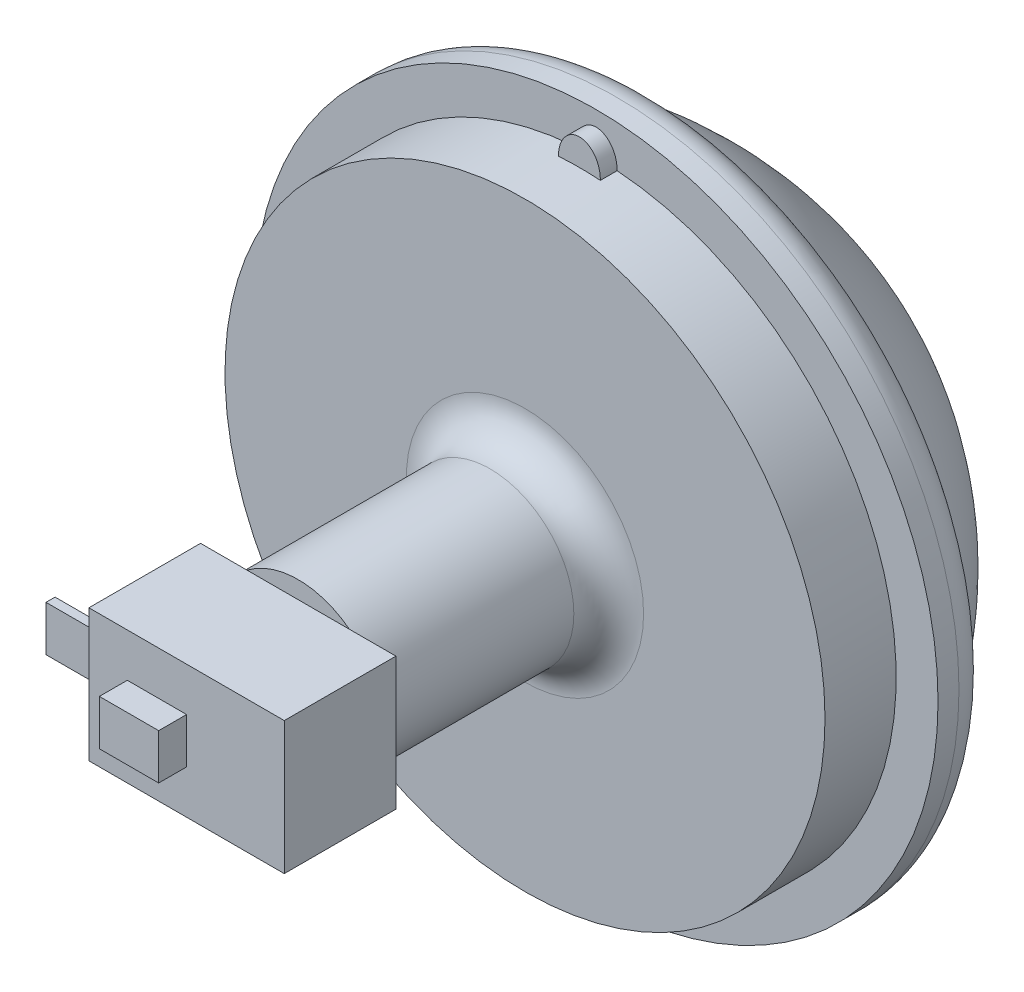
ISO-10303-21;
HEADER;
FILE_DESCRIPTION(('STEP AP214'),'2;1');
FILE_NAME('part.step','',(''),(''),'','','');
FILE_SCHEMA(('AUTOMOTIVE_DESIGN { 1 0 10303 214 1 1 1 1 }'));
ENDSEC;
DATA;
#1=APPLICATION_CONTEXT('core data for automotive mechanical design processes');
#2=APPLICATION_PROTOCOL_DEFINITION('international standard','automotive_design',2000,#1);
#3=PRODUCT_CONTEXT('',#1,'mechanical');
#4=PRODUCT('Part','Part','',(#3));
#5=PRODUCT_RELATED_PRODUCT_CATEGORY('part','',(#4));
#6=PRODUCT_DEFINITION_FORMATION('','',#4);
#7=PRODUCT_DEFINITION_CONTEXT('part definition',#1,'design');
#8=PRODUCT_DEFINITION('design','',#6,#7);
#9=PRODUCT_DEFINITION_SHAPE('','',#8);
#10=(LENGTH_UNIT() NAMED_UNIT(*) SI_UNIT(.MILLI.,.METRE.));
#11=(NAMED_UNIT(*) PLANE_ANGLE_UNIT() SI_UNIT($,.RADIAN.));
#12=(NAMED_UNIT(*) SI_UNIT($,.STERADIAN.) SOLID_ANGLE_UNIT());
#13=UNCERTAINTY_MEASURE_WITH_UNIT(LENGTH_MEASURE(1.E-05),#10,'distance_accuracy_value','');
#14=(GEOMETRIC_REPRESENTATION_CONTEXT(3) GLOBAL_UNCERTAINTY_ASSIGNED_CONTEXT((#13)) GLOBAL_UNIT_ASSIGNED_CONTEXT((#10,
#11,#12)) REPRESENTATION_CONTEXT('',''));
#15=CARTESIAN_POINT('',(0.,0.,0.));
#16=DIRECTION('',(0.,0.,1.));
#17=DIRECTION('',(1.,0.,0.));
#18=AXIS2_PLACEMENT_3D('',#15,#16,#17);
#19=CARTESIAN_POINT('',(0.,0.,10.2));
#20=DIRECTION('',(0.,0.,-1.));
#21=DIRECTION('',(-1.,0.,0.));
#22=AXIS2_PLACEMENT_3D('',#19,#20,#21);
#23=CYLINDRICAL_SURFACE('',#22,43.);
#24=CARTESIAN_POINT('',(0.,0.,10.2));
#25=DIRECTION('',(0.,0.,1.));
#26=DIRECTION('',(1.,0.,0.));
#27=AXIS2_PLACEMENT_3D('',#24,#25,#26);
#28=CIRCLE('',#27,43.);
#29=CARTESIAN_POINT('',(43.,0.,10.2));
#30=VERTEX_POINT('',#29);
#31=EDGE_CURVE('E242',#30,#30,#28,.T.);
#32=ORIENTED_EDGE('',*,*,#31,.F.);
#33=EDGE_LOOP('',(#32));
#34=FACE_BOUND('',#33,.T.);
#35=DIRECTION('',(0.,0.,-1.));
#36=VECTOR('',#35,1.);
#37=CARTESIAN_POINT('',(-2.99886108033144,42.8953008174657,2.4));
#38=LINE('',#37,#36);
#39=CARTESIAN_POINT('',(-2.99886108033149,42.8953008174657,0.));
#40=VERTEX_POINT('',#39);
#41=CARTESIAN_POINT('',(-2.99886108033149,42.8953008174657,2.4));
#42=VERTEX_POINT('',#41);
#43=EDGE_CURVE('E11',#40,#42,#38,.F.);
#44=ORIENTED_EDGE('',*,*,#43,.F.);
#45=CARTESIAN_POINT('',(0.,0.,0.));
#46=DIRECTION('',(0.,0.,1.));
#47=DIRECTION('',(1.,0.,0.));
#48=AXIS2_PLACEMENT_3D('',#45,#46,#47);
#49=CIRCLE('',#48,43.);
#50=CARTESIAN_POINT('',(-2.99886108033149,-42.8953008174657,0.));
#51=VERTEX_POINT('',#50);
#52=EDGE_CURVE('E189',#40,#51,#49,.T.);
#53=ORIENTED_EDGE('',*,*,#52,.T.);
#54=DIRECTION('',(0.,0.,-1.));
#55=VECTOR('',#54,1.);
#56=CARTESIAN_POINT('',(-2.99886108033144,-42.8953008174657,2.4));
#57=LINE('',#56,#55);
#58=CARTESIAN_POINT('',(-2.99886108033149,-42.8953008174657,2.4));
#59=VERTEX_POINT('',#58);
#60=EDGE_CURVE('E216',#51,#59,#57,.F.);
#61=ORIENTED_EDGE('',*,*,#60,.T.);
#62=CARTESIAN_POINT('',(0.,0.,2.4));
#63=DIRECTION('',(0.,0.,-1.));
#64=DIRECTION('',(-1.,0.,0.));
#65=AXIS2_PLACEMENT_3D('',#62,#63,#64);
#66=CIRCLE('',#65,43.);
#67=CARTESIAN_POINT('',(2.99886108033149,-42.8953008174657,2.4));
#68=VERTEX_POINT('',#67);
#69=EDGE_CURVE('E75',#68,#59,#66,.T.);
#70=ORIENTED_EDGE('',*,*,#69,.F.);
#71=DIRECTION('',(0.,0.,-1.));
#72=VECTOR('',#71,1.);
#73=CARTESIAN_POINT('',(2.99886108033144,-42.8953008174657,2.4));
#74=LINE('',#73,#72);
#75=CARTESIAN_POINT('',(2.99886108033149,-42.8953008174657,0.));
#76=VERTEX_POINT('',#75);
#77=EDGE_CURVE('E212',#68,#76,#74,.T.);
#78=ORIENTED_EDGE('',*,*,#77,.T.);
#79=CARTESIAN_POINT('',(2.99886108033149,42.8953008174657,0.));
#80=VERTEX_POINT('',#79);
#81=EDGE_CURVE('E194',#76,#80,#49,.T.);
#82=ORIENTED_EDGE('',*,*,#81,.T.);
#83=DIRECTION('',(0.,0.,-1.));
#84=VECTOR('',#83,1.);
#85=CARTESIAN_POINT('',(2.99886108033144,42.8953008174657,2.4));
#86=LINE('',#85,#84);
#87=CARTESIAN_POINT('',(2.99886108033149,42.8953008174657,2.4));
#88=VERTEX_POINT('',#87);
#89=EDGE_CURVE('E62',#88,#80,#86,.T.);
#90=ORIENTED_EDGE('',*,*,#89,.F.);
#91=CARTESIAN_POINT('',(0.,0.,2.4));
#92=DIRECTION('',(0.,0.,1.));
#93=DIRECTION('',(1.,0.,0.));
#94=AXIS2_PLACEMENT_3D('',#91,#92,#93);
#95=CIRCLE('',#94,43.);
#96=EDGE_CURVE('E219',#88,#42,#95,.T.);
#97=ORIENTED_EDGE('',*,*,#96,.T.);
#98=EDGE_LOOP('',(#44,#53,#61,#70,#78,#82,#90,#97));
#99=FACE_BOUND('',#98,.T.);
#100=ADVANCED_FACE('F53',(#34,#99),#23,.T.);
#101=CARTESIAN_POINT('',(-14.,9.5,58.7));
#102=DIRECTION('',(1.,0.,0.));
#103=DIRECTION('',(0.,1.,0.));
#104=AXIS2_PLACEMENT_3D('',#101,#102,#103);
#105=PLANE('',#104);
#106=DIRECTION('',(0.,-1.,0.));
#107=VECTOR('',#106,1.);
#108=CARTESIAN_POINT('',(-14.,9.5,42.7));
#109=LINE('',#108,#107);
#110=CARTESIAN_POINT('',(-14.,9.5,42.7));
#111=VERTEX_POINT('',#110);
#112=CARTESIAN_POINT('',(-14.,-9.5,42.7));
#113=VERTEX_POINT('',#112);
#114=EDGE_CURVE('E295',#111,#113,#109,.T.);
#115=ORIENTED_EDGE('',*,*,#114,.T.);
#116=DIRECTION('',(0.,0.,-1.));
#117=VECTOR('',#116,1.);
#118=CARTESIAN_POINT('',(-14.,-9.5,58.7));
#119=LINE('',#118,#117);
#120=CARTESIAN_POINT('',(-14.,-9.5,58.7));
#121=VERTEX_POINT('',#120);
#122=EDGE_CURVE('E278',#121,#113,#119,.T.);
#123=ORIENTED_EDGE('',*,*,#122,.F.);
#124=DIRECTION('',(0.,-1.,0.));
#125=VECTOR('',#124,1.);
#126=CARTESIAN_POINT('',(-14.,9.5,58.7));
#127=LINE('',#126,#125);
#128=CARTESIAN_POINT('',(-14.,9.5,58.7));
#129=VERTEX_POINT('',#128);
#130=EDGE_CURVE('E308',#129,#121,#127,.T.);
#131=ORIENTED_EDGE('',*,*,#130,.F.);
#132=DIRECTION('',(0.,0.,-1.));
#133=VECTOR('',#132,1.);
#134=CARTESIAN_POINT('',(-14.,9.5,58.7));
#135=LINE('',#134,#133);
#136=EDGE_CURVE('E272',#129,#111,#135,.T.);
#137=ORIENTED_EDGE('',*,*,#136,.T.);
#138=EDGE_LOOP('',(#115,#123,#131,#137));
#139=FACE_BOUND('',#138,.T.);
#140=DIRECTION('',(0.,1.,0.));
#141=VECTOR('',#140,1.);
#142=CARTESIAN_POINT('',(-14.,3.25000000000001,54.85));
#143=LINE('',#142,#141);
#144=CARTESIAN_POINT('',(-14.,-3.24999999999999,54.85));
#145=VERTEX_POINT('',#144);
#146=CARTESIAN_POINT('',(-14.,3.25000000000001,54.85));
#147=VERTEX_POINT('',#146);
#148=EDGE_CURVE('E387',#145,#147,#143,.T.);
#149=ORIENTED_EDGE('',*,*,#148,.F.);
#150=DIRECTION('',(0.,0.,1.));
#151=VECTOR('',#150,1.);
#152=CARTESIAN_POINT('',(-14.,-3.24999999999999,53.55));
#153=LINE('',#152,#151);
#154=CARTESIAN_POINT('',(-14.,-3.24999999999999,53.55));
#155=VERTEX_POINT('',#154);
#156=EDGE_CURVE('E374',#155,#145,#153,.T.);
#157=ORIENTED_EDGE('',*,*,#156,.F.);
#158=DIRECTION('',(0.,-1.,0.));
#159=VECTOR('',#158,1.);
#160=CARTESIAN_POINT('',(-14.,3.25000000000001,53.55));
#161=LINE('',#160,#159);
#162=CARTESIAN_POINT('',(-14.,3.25000000000001,53.55));
#163=VERTEX_POINT('',#162);
#164=EDGE_CURVE('E379',#163,#155,#161,.T.);
#165=ORIENTED_EDGE('',*,*,#164,.F.);
#166=DIRECTION('',(0.,0.,-1.));
#167=VECTOR('',#166,1.);
#168=CARTESIAN_POINT('',(-14.,3.25000000000001,53.55));
#169=LINE('',#168,#167);
#170=EDGE_CURVE('E383',#147,#163,#169,.T.);
#171=ORIENTED_EDGE('',*,*,#170,.F.);
#172=EDGE_LOOP('',(#149,#157,#165,#171));
#173=FACE_BOUND('',#172,.T.);
#174=ADVANCED_FACE('F463',(#139,#173),#105,.F.);
#175=CARTESIAN_POINT('',(0.,0.,58.7));
#176=DIRECTION('',(0.,0.,1.));
#177=DIRECTION('',(1.,0.,0.));
#178=AXIS2_PLACEMENT_3D('',#175,#176,#177);
#179=PLANE('',#178);
#180=DIRECTION('',(0.,1.,0.));
#181=VECTOR('',#180,1.);
#182=CARTESIAN_POINT('',(14.,9.5,58.7));
#183=LINE('',#182,#181);
#184=CARTESIAN_POINT('',(14.,-9.5,58.7));
#185=VERTEX_POINT('',#184);
#186=CARTESIAN_POINT('',(14.,9.5,58.7));
#187=VERTEX_POINT('',#186);
#188=EDGE_CURVE('E293',#185,#187,#183,.T.);
#189=ORIENTED_EDGE('',*,*,#188,.T.);
#190=DIRECTION('',(-1.,0.,0.));
#191=VECTOR('',#190,1.);
#192=CARTESIAN_POINT('',(-14.,9.5,58.7));
#193=LINE('',#192,#191);
#194=EDGE_CURVE('E311',#187,#129,#193,.T.);
#195=ORIENTED_EDGE('',*,*,#194,.T.);
#196=ORIENTED_EDGE('',*,*,#130,.T.);
#197=DIRECTION('',(1.,0.,0.));
#198=VECTOR('',#197,1.);
#199=CARTESIAN_POINT('',(-14.,-9.5,58.7));
#200=LINE('',#199,#198);
#201=EDGE_CURVE('E288',#121,#185,#200,.T.);
#202=ORIENTED_EDGE('',*,*,#201,.T.);
#203=EDGE_LOOP('',(#189,#195,#196,#202));
#204=FACE_BOUND('',#203,.T.);
#205=DIRECTION('',(-1.,0.,0.));
#206=VECTOR('',#205,1.);
#207=CARTESIAN_POINT('',(0.,3.25,58.7));
#208=LINE('',#207,#206);
#209=CARTESIAN_POINT('',(0.,3.25,58.7));
#210=VERTEX_POINT('',#209);
#211=CARTESIAN_POINT('',(-8.5,3.25,58.7));
#212=VERTEX_POINT('',#211);
#213=EDGE_CURVE('E339',#210,#212,#208,.T.);
#214=ORIENTED_EDGE('',*,*,#213,.F.);
#215=DIRECTION('',(0.,1.,0.));
#216=VECTOR('',#215,1.);
#217=CARTESIAN_POINT('',(0.,3.25,58.7));
#218=LINE('',#217,#216);
#219=CARTESIAN_POINT('',(0.,-3.25,58.7));
#220=VERTEX_POINT('',#219);
#221=EDGE_CURVE('E342',#220,#210,#218,.T.);
#222=ORIENTED_EDGE('',*,*,#221,.F.);
#223=DIRECTION('',(1.,0.,0.));
#224=VECTOR('',#223,1.);
#225=CARTESIAN_POINT('',(0.,-3.25,58.7));
#226=LINE('',#225,#224);
#227=CARTESIAN_POINT('',(-8.5,-3.25,58.7));
#228=VERTEX_POINT('',#227);
#229=EDGE_CURVE('E331',#228,#220,#226,.T.);
#230=ORIENTED_EDGE('',*,*,#229,.F.);
#231=DIRECTION('',(0.,-1.,0.));
#232=VECTOR('',#231,1.);
#233=CARTESIAN_POINT('',(-8.5,3.25,58.7));
#234=LINE('',#233,#232);
#235=EDGE_CURVE('E335',#212,#228,#234,.T.);
#236=ORIENTED_EDGE('',*,*,#235,.F.);
#237=EDGE_LOOP('',(#214,#222,#230,#236));
#238=FACE_BOUND('',#237,.T.);
#239=ADVANCED_FACE('F459',(#204,#238),#179,.T.);
#240=CARTESIAN_POINT('',(0.,0.,42.7));
#241=DIRECTION('',(0.,0.,1.));
#242=DIRECTION('',(1.,0.,0.));
#243=AXIS2_PLACEMENT_3D('',#240,#241,#242);
#244=PLANE('',#243);
#245=DIRECTION('',(1.,0.,0.));
#246=VECTOR('',#245,1.);
#247=CARTESIAN_POINT('',(-14.,-9.5,42.7));
#248=LINE('',#247,#246);
#249=CARTESIAN_POINT('',(-7.33143914930759,-9.5,42.7));
#250=VERTEX_POINT('',#249);
#251=CARTESIAN_POINT('',(7.33143914930759,-9.5,42.7));
#252=VERTEX_POINT('',#251);
#253=EDGE_CURVE('E213',#250,#252,#248,.T.);
#254=ORIENTED_EDGE('',*,*,#253,.F.);
#255=CARTESIAN_POINT('',(0.,0.,42.7));
#256=DIRECTION('',(0.,0.,1.));
#257=DIRECTION('',(1.,0.,0.));
#258=AXIS2_PLACEMENT_3D('',#255,#256,#257);
#259=CIRCLE('',#258,12.);
#260=EDGE_CURVE('E260',#250,#252,#259,.T.);
#261=ORIENTED_EDGE('',*,*,#260,.T.);
#262=EDGE_LOOP('',(#254,#261));
#263=FACE_BOUND('',#262,.T.);
#264=ADVANCED_FACE('F462',(#263),#244,.T.);
#265=CARTESIAN_POINT('',(0.,0.,-8.));
#266=DIRECTION('',(0.,0.,1.));
#267=DIRECTION('',(1.,0.,0.));
#268=AXIS2_PLACEMENT_3D('',#265,#266,#267);
#269=CYLINDRICAL_SURFACE('',#268,49.);
#270=CARTESIAN_POINT('',(0.,0.,-3.));
#271=DIRECTION('',(0.,0.,1.));
#272=DIRECTION('',(1.,0.,0.));
#273=AXIS2_PLACEMENT_3D('',#270,#271,#272);
#274=CIRCLE('',#273,49.);
#275=CARTESIAN_POINT('',(49.,0.,-3.));
#276=VERTEX_POINT('',#275);
#277=EDGE_CURVE('E190',#276,#276,#274,.T.);
#278=ORIENTED_EDGE('',*,*,#277,.T.);
#279=EDGE_LOOP('',(#278));
#280=FACE_BOUND('',#279,.T.);
#281=CARTESIAN_POINT('',(0.,0.,0.));
#282=DIRECTION('',(0.,0.,1.));
#283=DIRECTION('',(1.,0.,0.));
#284=AXIS2_PLACEMENT_3D('',#281,#282,#283);
#285=CIRCLE('',#284,49.);
#286=CARTESIAN_POINT('',(49.,0.,0.));
#287=VERTEX_POINT('',#286);
#288=EDGE_CURVE('E197',#287,#287,#285,.T.);
#289=ORIENTED_EDGE('',*,*,#288,.F.);
#290=EDGE_LOOP('',(#289));
#291=FACE_BOUND('',#290,.T.);
#292=ADVANCED_FACE('F500',(#280,#291),#269,.T.);
#293=CARTESIAN_POINT('',(0.,0.,0.));
#294=DIRECTION('',(0.,0.,1.));
#295=DIRECTION('',(1.,0.,0.));
#296=AXIS2_PLACEMENT_3D('',#293,#294,#295);
#297=PLANE('',#296);
#298=ORIENTED_EDGE('',*,*,#52,.F.);
#299=CARTESIAN_POINT('',(0.,43.,0.));
#300=DIRECTION('',(0.,0.,1.));
#301=DIRECTION('',(0.,-1.,0.));
#302=AXIS2_PLACEMENT_3D('',#299,#300,#301);
#303=ELLIPSE('',#302,3.8,2.99999999999999);
#304=EDGE_CURVE('E227',#80,#40,#303,.T.);
#305=ORIENTED_EDGE('',*,*,#304,.F.);
#306=ORIENTED_EDGE('',*,*,#81,.F.);
#307=CARTESIAN_POINT('',(0.,-43.,0.));
#308=DIRECTION('',(0.,0.,-1.));
#309=DIRECTION('',(0.,1.,0.));
#310=AXIS2_PLACEMENT_3D('',#307,#308,#309);
#311=ELLIPSE('',#310,3.8,2.99999999999999);
#312=EDGE_CURVE('E238',#76,#51,#311,.T.);
#313=ORIENTED_EDGE('',*,*,#312,.T.);
#314=EDGE_LOOP('',(#298,#305,#306,#313));
#315=FACE_BOUND('',#314,.T.);
#316=ORIENTED_EDGE('',*,*,#288,.T.);
#317=EDGE_LOOP('',(#316));
#318=FACE_BOUND('',#317,.T.);
#319=ADVANCED_FACE('F233',(#315,#318),#297,.T.);
#320=CARTESIAN_POINT('',(0.,0.,-3.));
#321=DIRECTION('',(0.,0.,1.));
#322=DIRECTION('',(1.,0.,0.));
#323=AXIS2_PLACEMENT_3D('',#320,#321,#322);
#324=TOROIDAL_SURFACE('',#323,44.,5.);
#325=CARTESIAN_POINT('',(0.,0.,-8.));
#326=DIRECTION('',(0.,0.,1.));
#327=DIRECTION('',(1.,0.,0.));
#328=AXIS2_PLACEMENT_3D('',#325,#326,#327);
#329=CIRCLE('',#328,44.);
#330=CARTESIAN_POINT('',(44.,0.,-8.));
#331=VERTEX_POINT('',#330);
#332=EDGE_CURVE('E186',#331,#331,#329,.F.);
#333=ORIENTED_EDGE('',*,*,#332,.F.);
#334=EDGE_LOOP('',(#333));
#335=FACE_BOUND('',#334,.T.);
#336=ORIENTED_EDGE('',*,*,#277,.F.);
#337=EDGE_LOOP('',(#336));
#338=FACE_BOUND('',#337,.T.);
#339=ADVANCED_FACE('F493',(#335,#338),#324,.T.);
#340=CARTESIAN_POINT('',(0.,0.,10.2));
#341=DIRECTION('',(0.,0.,1.));
#342=DIRECTION('',(1.,0.,0.));
#343=AXIS2_PLACEMENT_3D('',#340,#341,#342);
#344=PLANE('',#343);
#345=CARTESIAN_POINT('',(0.,0.,10.2));
#346=DIRECTION('',(0.,0.,1.));
#347=DIRECTION('',(1.,0.,0.));
#348=AXIS2_PLACEMENT_3D('',#345,#346,#347);
#349=CIRCLE('',#348,17.);
#350=CARTESIAN_POINT('',(17.,0.,10.2));
#351=VERTEX_POINT('',#350);
#352=EDGE_CURVE('E205',#351,#351,#349,.F.);
#353=ORIENTED_EDGE('',*,*,#352,.T.);
#354=EDGE_LOOP('',(#353));
#355=FACE_BOUND('',#354,.T.);
#356=ORIENTED_EDGE('',*,*,#31,.T.);
#357=EDGE_LOOP('',(#356));
#358=FACE_BOUND('',#357,.T.);
#359=ADVANCED_FACE('F489',(#355,#358),#344,.T.);
#360=CARTESIAN_POINT('',(0.,0.,42.7));
#361=DIRECTION('',(0.,0.,-1.));
#362=DIRECTION('',(-1.,0.,0.));
#363=AXIS2_PLACEMENT_3D('',#360,#361,#362);
#364=CYLINDRICAL_SURFACE('',#363,12.);
#365=CARTESIAN_POINT('',(0.,0.,15.2));
#366=DIRECTION('',(0.,0.,1.));
#367=DIRECTION('',(1.,0.,0.));
#368=AXIS2_PLACEMENT_3D('',#365,#366,#367);
#369=CIRCLE('',#368,12.);
#370=CARTESIAN_POINT('',(12.,0.,15.2));
#371=VERTEX_POINT('',#370);
#372=EDGE_CURVE('E201',#371,#371,#369,.T.);
#373=ORIENTED_EDGE('',*,*,#372,.T.);
#374=EDGE_LOOP('',(#373));
#375=FACE_BOUND('',#374,.T.);
#376=CARTESIAN_POINT('',(7.3314391493076,9.5,42.7));
#377=VERTEX_POINT('',#376);
#378=CARTESIAN_POINT('',(-7.3314391493076,9.5,42.7));
#379=VERTEX_POINT('',#378);
#380=EDGE_CURVE('E249',#377,#379,#259,.T.);
#381=ORIENTED_EDGE('',*,*,#380,.F.);
#382=EDGE_CURVE('E254',#252,#377,#259,.T.);
#383=ORIENTED_EDGE('',*,*,#382,.F.);
#384=ORIENTED_EDGE('',*,*,#260,.F.);
#385=EDGE_CURVE('E253',#379,#250,#259,.T.);
#386=ORIENTED_EDGE('',*,*,#385,.F.);
#387=EDGE_LOOP('',(#381,#383,#384,#386));
#388=FACE_BOUND('',#387,.T.);
#389=ADVANCED_FACE('F486',(#375,#388),#364,.T.);
#390=DIRECTION('',(-1.,0.,0.));
#391=VECTOR('',#390,1.);
#392=CARTESIAN_POINT('',(-14.,9.5,42.7));
#393=LINE('',#392,#391);
#394=EDGE_CURVE('E209',#377,#379,#393,.T.);
#395=ORIENTED_EDGE('',*,*,#394,.F.);
#396=ORIENTED_EDGE('',*,*,#380,.T.);
#397=EDGE_LOOP('',(#395,#396));
#398=FACE_BOUND('',#397,.T.);
#399=ADVANCED_FACE('F483',(#398),#244,.T.);
#400=CARTESIAN_POINT('',(0.,0.,15.2));
#401=DIRECTION('',(0.,0.,1.));
#402=DIRECTION('',(1.,0.,0.));
#403=AXIS2_PLACEMENT_3D('',#400,#401,#402);
#404=TOROIDAL_SURFACE('',#403,17.,5.);
#405=ORIENTED_EDGE('',*,*,#352,.F.);
#406=EDGE_LOOP('',(#405));
#407=FACE_BOUND('',#406,.T.);
#408=ORIENTED_EDGE('',*,*,#372,.F.);
#409=EDGE_LOOP('',(#408));
#410=FACE_BOUND('',#409,.T.);
#411=ADVANCED_FACE('F55',(#407,#410),#404,.F.);
#412=CARTESIAN_POINT('',(0.,0.,42.7));
#413=DIRECTION('',(0.,0.,1.));
#414=DIRECTION('',(1.,0.,0.));
#415=AXIS2_PLACEMENT_3D('',#412,#413,#414);
#416=PLANE('',#415);
#417=EDGE_CURVE('E301',#379,#111,#393,.T.);
#418=ORIENTED_EDGE('',*,*,#417,.F.);
#419=ORIENTED_EDGE('',*,*,#385,.T.);
#420=EDGE_CURVE('E289',#113,#250,#248,.T.);
#421=ORIENTED_EDGE('',*,*,#420,.F.);
#422=ORIENTED_EDGE('',*,*,#114,.F.);
#423=EDGE_LOOP('',(#418,#419,#421,#422));
#424=FACE_BOUND('',#423,.T.);
#425=ADVANCED_FACE('F465',(#424),#416,.F.);
#426=CARTESIAN_POINT('',(14.,-9.5,42.7));
#427=VERTEX_POINT('',#426);
#428=EDGE_CURVE('E294',#252,#427,#248,.T.);
#429=ORIENTED_EDGE('',*,*,#428,.F.);
#430=ORIENTED_EDGE('',*,*,#382,.T.);
#431=CARTESIAN_POINT('',(14.,9.5,42.7));
#432=VERTEX_POINT('',#431);
#433=EDGE_CURVE('E298',#432,#377,#393,.T.);
#434=ORIENTED_EDGE('',*,*,#433,.F.);
#435=DIRECTION('',(0.,1.,0.));
#436=VECTOR('',#435,1.);
#437=CARTESIAN_POINT('',(14.,9.5,42.7));
#438=LINE('',#437,#436);
#439=EDGE_CURVE('E302',#427,#432,#438,.T.);
#440=ORIENTED_EDGE('',*,*,#439,.F.);
#441=EDGE_LOOP('',(#429,#430,#434,#440));
#442=FACE_BOUND('',#441,.T.);
#443=ADVANCED_FACE('F468',(#442),#416,.F.);
#444=CARTESIAN_POINT('',(14.,9.5,58.7));
#445=DIRECTION('',(-1.,0.,0.));
#446=DIRECTION('',(0.,0.,1.));
#447=AXIS2_PLACEMENT_3D('',#444,#445,#446);
#448=PLANE('',#447);
#449=ORIENTED_EDGE('',*,*,#439,.T.);
#450=DIRECTION('',(0.,0.,-1.));
#451=VECTOR('',#450,1.);
#452=CARTESIAN_POINT('',(14.,9.5,58.7));
#453=LINE('',#452,#451);
#454=EDGE_CURVE('E264',#187,#432,#453,.T.);
#455=ORIENTED_EDGE('',*,*,#454,.F.);
#456=ORIENTED_EDGE('',*,*,#188,.F.);
#457=DIRECTION('',(0.,0.,-1.));
#458=VECTOR('',#457,1.);
#459=CARTESIAN_POINT('',(14.,-9.5,58.7));
#460=LINE('',#459,#458);
#461=EDGE_CURVE('E284',#185,#427,#460,.T.);
#462=ORIENTED_EDGE('',*,*,#461,.T.);
#463=EDGE_LOOP('',(#449,#455,#456,#462));
#464=FACE_BOUND('',#463,.T.);
#465=ADVANCED_FACE('F479',(#464),#448,.F.);
#466=CARTESIAN_POINT('',(-14.,9.5,58.7));
#467=DIRECTION('',(0.,-1.,0.));
#468=DIRECTION('',(0.,0.,-1.));
#469=AXIS2_PLACEMENT_3D('',#466,#467,#468);
#470=PLANE('',#469);
#471=ORIENTED_EDGE('',*,*,#433,.T.);
#472=ORIENTED_EDGE('',*,*,#394,.T.);
#473=ORIENTED_EDGE('',*,*,#417,.T.);
#474=ORIENTED_EDGE('',*,*,#136,.F.);
#475=ORIENTED_EDGE('',*,*,#194,.F.);
#476=ORIENTED_EDGE('',*,*,#454,.T.);
#477=EDGE_LOOP('',(#471,#472,#473,#474,#475,#476));
#478=FACE_BOUND('',#477,.T.);
#479=ADVANCED_FACE('F472',(#478),#470,.F.);
#480=CARTESIAN_POINT('',(-14.,-9.5,58.7));
#481=DIRECTION('',(0.,1.,0.));
#482=DIRECTION('',(0.,0.,1.));
#483=AXIS2_PLACEMENT_3D('',#480,#481,#482);
#484=PLANE('',#483);
#485=ORIENTED_EDGE('',*,*,#420,.T.);
#486=ORIENTED_EDGE('',*,*,#253,.T.);
#487=ORIENTED_EDGE('',*,*,#428,.T.);
#488=ORIENTED_EDGE('',*,*,#461,.F.);
#489=ORIENTED_EDGE('',*,*,#201,.F.);
#490=ORIENTED_EDGE('',*,*,#122,.T.);
#491=EDGE_LOOP('',(#485,#486,#487,#488,#489,#490));
#492=FACE_BOUND('',#491,.T.);
#493=ADVANCED_FACE('F457',(#492),#484,.F.);
#494=CARTESIAN_POINT('',(0.,3.25,62.7));
#495=DIRECTION('',(-1.,0.,0.));
#496=DIRECTION('',(0.,0.,1.));
#497=AXIS2_PLACEMENT_3D('',#494,#495,#496);
#498=PLANE('',#497);
#499=ORIENTED_EDGE('',*,*,#221,.T.);
#500=DIRECTION('',(0.,0.,-1.));
#501=VECTOR('',#500,1.);
#502=CARTESIAN_POINT('',(0.,3.25,62.7));
#503=LINE('',#502,#501);
#504=CARTESIAN_POINT('',(0.,3.25,62.7));
#505=VERTEX_POINT('',#504);
#506=EDGE_CURVE('E305',#505,#210,#503,.T.);
#507=ORIENTED_EDGE('',*,*,#506,.F.);
#508=DIRECTION('',(0.,1.,0.));
#509=VECTOR('',#508,1.);
#510=CARTESIAN_POINT('',(0.,3.25,62.7));
#511=LINE('',#510,#509);
#512=CARTESIAN_POINT('',(0.,-3.25,62.7));
#513=VERTEX_POINT('',#512);
#514=EDGE_CURVE('E334',#513,#505,#511,.T.);
#515=ORIENTED_EDGE('',*,*,#514,.F.);
#516=DIRECTION('',(0.,0.,-1.));
#517=VECTOR('',#516,1.);
#518=CARTESIAN_POINT('',(0.,-3.25,62.7));
#519=LINE('',#518,#517);
#520=EDGE_CURVE('E326',#513,#220,#519,.T.);
#521=ORIENTED_EDGE('',*,*,#520,.T.);
#522=EDGE_LOOP('',(#499,#507,#515,#521));
#523=FACE_BOUND('',#522,.T.);
#524=ADVANCED_FACE('F453',(#523),#498,.F.);
#525=CARTESIAN_POINT('',(0.,3.25,62.7));
#526=DIRECTION('',(0.,-1.,0.));
#527=DIRECTION('',(1.,0.,0.));
#528=AXIS2_PLACEMENT_3D('',#525,#526,#527);
#529=PLANE('',#528);
#530=ORIENTED_EDGE('',*,*,#213,.T.);
#531=DIRECTION('',(0.,0.,-1.));
#532=VECTOR('',#531,1.);
#533=CARTESIAN_POINT('',(-8.5,3.25,62.7));
#534=LINE('',#533,#532);
#535=CARTESIAN_POINT('',(-8.5,3.25,62.7));
#536=VERTEX_POINT('',#535);
#537=EDGE_CURVE('E319',#536,#212,#534,.T.);
#538=ORIENTED_EDGE('',*,*,#537,.F.);
#539=DIRECTION('',(-1.,0.,0.));
#540=VECTOR('',#539,1.);
#541=CARTESIAN_POINT('',(0.,3.25,62.7));
#542=LINE('',#541,#540);
#543=EDGE_CURVE('E352',#505,#536,#542,.T.);
#544=ORIENTED_EDGE('',*,*,#543,.F.);
#545=ORIENTED_EDGE('',*,*,#506,.T.);
#546=EDGE_LOOP('',(#530,#538,#544,#545));
#547=FACE_BOUND('',#546,.T.);
#548=ADVANCED_FACE('F449',(#547),#529,.F.);
#549=CARTESIAN_POINT('',(-8.5,3.25,62.7));
#550=DIRECTION('',(1.,0.,0.));
#551=DIRECTION('',(0.,0.,-1.));
#552=AXIS2_PLACEMENT_3D('',#549,#550,#551);
#553=PLANE('',#552);
#554=ORIENTED_EDGE('',*,*,#235,.T.);
#555=DIRECTION('',(0.,0.,-1.));
#556=VECTOR('',#555,1.);
#557=CARTESIAN_POINT('',(-8.5,-3.25,62.7));
#558=LINE('',#557,#556);
#559=CARTESIAN_POINT('',(-8.5,-3.25,62.7));
#560=VERTEX_POINT('',#559);
#561=EDGE_CURVE('E323',#560,#228,#558,.T.);
#562=ORIENTED_EDGE('',*,*,#561,.F.);
#563=DIRECTION('',(0.,-1.,0.));
#564=VECTOR('',#563,1.);
#565=CARTESIAN_POINT('',(-8.5,3.25,62.7));
#566=LINE('',#565,#564);
#567=EDGE_CURVE('E349',#536,#560,#566,.T.);
#568=ORIENTED_EDGE('',*,*,#567,.F.);
#569=ORIENTED_EDGE('',*,*,#537,.T.);
#570=EDGE_LOOP('',(#554,#562,#568,#569));
#571=FACE_BOUND('',#570,.T.);
#572=ADVANCED_FACE('F445',(#571),#553,.F.);
#573=CARTESIAN_POINT('',(0.,-3.25,62.7));
#574=DIRECTION('',(0.,1.,0.));
#575=DIRECTION('',(-1.,0.,0.));
#576=AXIS2_PLACEMENT_3D('',#573,#574,#575);
#577=PLANE('',#576);
#578=ORIENTED_EDGE('',*,*,#229,.T.);
#579=ORIENTED_EDGE('',*,*,#520,.F.);
#580=DIRECTION('',(1.,0.,0.));
#581=VECTOR('',#580,1.);
#582=CARTESIAN_POINT('',(0.,-3.25,62.7));
#583=LINE('',#582,#581);
#584=EDGE_CURVE('E330',#560,#513,#583,.T.);
#585=ORIENTED_EDGE('',*,*,#584,.F.);
#586=ORIENTED_EDGE('',*,*,#561,.T.);
#587=EDGE_LOOP('',(#578,#579,#585,#586));
#588=FACE_BOUND('',#587,.T.);
#589=ADVANCED_FACE('F441',(#588),#577,.F.);
#590=CARTESIAN_POINT('',(0.,0.,62.7));
#591=DIRECTION('',(0.,0.,-1.));
#592=DIRECTION('',(-1.,0.,0.));
#593=AXIS2_PLACEMENT_3D('',#590,#591,#592);
#594=PLANE('',#593);
#595=ORIENTED_EDGE('',*,*,#514,.T.);
#596=ORIENTED_EDGE('',*,*,#543,.T.);
#597=ORIENTED_EDGE('',*,*,#567,.T.);
#598=ORIENTED_EDGE('',*,*,#584,.T.);
#599=EDGE_LOOP('',(#595,#596,#597,#598));
#600=FACE_BOUND('',#599,.T.);
#601=ADVANCED_FACE('F437',(#600),#594,.F.);
#602=CARTESIAN_POINT('',(-24.,3.25000000000001,54.85));
#603=DIRECTION('',(0.,0.,-1.));
#604=DIRECTION('',(-1.,0.,0.));
#605=AXIS2_PLACEMENT_3D('',#602,#603,#604);
#606=PLANE('',#605);
#607=ORIENTED_EDGE('',*,*,#148,.T.);
#608=DIRECTION('',(1.,0.,0.));
#609=VECTOR('',#608,1.);
#610=CARTESIAN_POINT('',(-24.,3.25000000000001,54.85));
#611=LINE('',#610,#609);
#612=CARTESIAN_POINT('',(-24.,3.25000000000001,54.85));
#613=VERTEX_POINT('',#612);
#614=EDGE_CURVE('E346',#613,#147,#611,.T.);
#615=ORIENTED_EDGE('',*,*,#614,.F.);
#616=DIRECTION('',(0.,1.,0.));
#617=VECTOR('',#616,1.);
#618=CARTESIAN_POINT('',(-24.,3.25000000000001,54.85));
#619=LINE('',#618,#617);
#620=CARTESIAN_POINT('',(-24.,-3.24999999999999,54.85));
#621=VERTEX_POINT('',#620);
#622=EDGE_CURVE('E378',#621,#613,#619,.T.);
#623=ORIENTED_EDGE('',*,*,#622,.F.);
#624=DIRECTION('',(1.,0.,0.));
#625=VECTOR('',#624,1.);
#626=CARTESIAN_POINT('',(-24.,-3.24999999999999,54.85));
#627=LINE('',#626,#625);
#628=EDGE_CURVE('E369',#621,#145,#627,.T.);
#629=ORIENTED_EDGE('',*,*,#628,.T.);
#630=EDGE_LOOP('',(#607,#615,#623,#629));
#631=FACE_BOUND('',#630,.T.);
#632=ADVANCED_FACE('F433',(#631),#606,.F.);
#633=CARTESIAN_POINT('',(-24.,3.25000000000001,53.55));
#634=DIRECTION('',(0.,-1.,0.));
#635=DIRECTION('',(1.,0.,0.));
#636=AXIS2_PLACEMENT_3D('',#633,#634,#635);
#637=PLANE('',#636);
#638=ORIENTED_EDGE('',*,*,#170,.T.);
#639=DIRECTION('',(1.,0.,0.));
#640=VECTOR('',#639,1.);
#641=CARTESIAN_POINT('',(-24.,3.25000000000001,53.55));
#642=LINE('',#641,#640);
#643=CARTESIAN_POINT('',(-24.,3.25000000000001,53.55));
#644=VERTEX_POINT('',#643);
#645=EDGE_CURVE('E361',#644,#163,#642,.T.);
#646=ORIENTED_EDGE('',*,*,#645,.F.);
#647=DIRECTION('',(0.,0.,-1.));
#648=VECTOR('',#647,1.);
#649=CARTESIAN_POINT('',(-24.,3.25000000000001,53.55));
#650=LINE('',#649,#648);
#651=EDGE_CURVE('E397',#613,#644,#650,.T.);
#652=ORIENTED_EDGE('',*,*,#651,.F.);
#653=ORIENTED_EDGE('',*,*,#614,.T.);
#654=EDGE_LOOP('',(#638,#646,#652,#653));
#655=FACE_BOUND('',#654,.T.);
#656=ADVANCED_FACE('F429',(#655),#637,.F.);
#657=CARTESIAN_POINT('',(-24.,3.25000000000001,53.55));
#658=DIRECTION('',(0.,0.,1.));
#659=DIRECTION('',(1.,0.,0.));
#660=AXIS2_PLACEMENT_3D('',#657,#658,#659);
#661=PLANE('',#660);
#662=ORIENTED_EDGE('',*,*,#164,.T.);
#663=DIRECTION('',(1.,0.,0.));
#664=VECTOR('',#663,1.);
#665=CARTESIAN_POINT('',(-24.,-3.24999999999999,53.55));
#666=LINE('',#665,#664);
#667=CARTESIAN_POINT('',(-24.,-3.24999999999999,53.55));
#668=VERTEX_POINT('',#667);
#669=EDGE_CURVE('E365',#668,#155,#666,.T.);
#670=ORIENTED_EDGE('',*,*,#669,.F.);
#671=DIRECTION('',(0.,-1.,0.));
#672=VECTOR('',#671,1.);
#673=CARTESIAN_POINT('',(-24.,3.25000000000001,53.55));
#674=LINE('',#673,#672);
#675=EDGE_CURVE('E394',#644,#668,#674,.T.);
#676=ORIENTED_EDGE('',*,*,#675,.F.);
#677=ORIENTED_EDGE('',*,*,#645,.T.);
#678=EDGE_LOOP('',(#662,#670,#676,#677));
#679=FACE_BOUND('',#678,.T.);
#680=ADVANCED_FACE('F425',(#679),#661,.F.);
#681=CARTESIAN_POINT('',(-24.,-3.24999999999999,53.55));
#682=DIRECTION('',(0.,1.,0.));
#683=DIRECTION('',(-1.,0.,0.));
#684=AXIS2_PLACEMENT_3D('',#681,#682,#683);
#685=PLANE('',#684);
#686=ORIENTED_EDGE('',*,*,#156,.T.);
#687=ORIENTED_EDGE('',*,*,#628,.F.);
#688=DIRECTION('',(0.,0.,1.));
#689=VECTOR('',#688,1.);
#690=CARTESIAN_POINT('',(-24.,-3.24999999999999,53.55));
#691=LINE('',#690,#689);
#692=EDGE_CURVE('E373',#668,#621,#691,.T.);
#693=ORIENTED_EDGE('',*,*,#692,.F.);
#694=ORIENTED_EDGE('',*,*,#669,.T.);
#695=EDGE_LOOP('',(#686,#687,#693,#694));
#696=FACE_BOUND('',#695,.T.);
#697=ADVANCED_FACE('F421',(#696),#685,.F.);
#698=CARTESIAN_POINT('',(-24.,0.,0.));
#699=DIRECTION('',(-1.,0.,0.));
#700=DIRECTION('',(0.,-1.,0.));
#701=AXIS2_PLACEMENT_3D('',#698,#699,#700);
#702=PLANE('',#701);
#703=ORIENTED_EDGE('',*,*,#622,.T.);
#704=ORIENTED_EDGE('',*,*,#651,.T.);
#705=ORIENTED_EDGE('',*,*,#675,.T.);
#706=ORIENTED_EDGE('',*,*,#692,.T.);
#707=EDGE_LOOP('',(#703,#704,#705,#706));
#708=FACE_BOUND('',#707,.T.);
#709=ADVANCED_FACE('F416',(#708),#702,.T.);
#710=CARTESIAN_POINT('',(0.,-43.,2.4));
#711=DIRECTION('',(0.,0.,-1.));
#712=DIRECTION('',(0.,1.,0.));
#713=AXIS2_PLACEMENT_3D('',#710,#711,#712);
#714=ELLIPSE('',#713,3.8,2.99999999999999);
#715=DIRECTION('',(0.,0.,-1.));
#716=VECTOR('',#715,1.);
#717=SURFACE_OF_LINEAR_EXTRUSION('',#714,#716);
#718=ORIENTED_EDGE('',*,*,#60,.F.);
#719=ORIENTED_EDGE('',*,*,#312,.F.);
#720=ORIENTED_EDGE('',*,*,#77,.F.);
#721=EDGE_CURVE('E391',#68,#59,#714,.T.);
#722=ORIENTED_EDGE('',*,*,#721,.T.);
#723=EDGE_LOOP('',(#718,#719,#720,#722));
#724=FACE_BOUND('',#723,.T.);
#725=ADVANCED_FACE('F411',(#724),#717,.T.);
#726=CARTESIAN_POINT('',(0.,-43.,2.4));
#727=DIRECTION('',(0.,0.,-1.));
#728=DIRECTION('',(-1.,0.,0.));
#729=AXIS2_PLACEMENT_3D('',#726,#727,#728);
#730=PLANE('',#729);
#731=ORIENTED_EDGE('',*,*,#721,.F.);
#732=ORIENTED_EDGE('',*,*,#69,.T.);
#733=EDGE_LOOP('',(#731,#732));
#734=FACE_BOUND('',#733,.T.);
#735=ADVANCED_FACE('F415',(#734),#730,.F.);
#736=CARTESIAN_POINT('',(0.,43.,2.4));
#737=DIRECTION('',(0.,0.,1.));
#738=DIRECTION('',(0.,-1.,0.));
#739=AXIS2_PLACEMENT_3D('',#736,#737,#738);
#740=ELLIPSE('',#739,3.8,2.99999999999999);
#741=DIRECTION('',(0.,0.,-1.));
#742=VECTOR('',#741,1.);
#743=SURFACE_OF_LINEAR_EXTRUSION('',#740,#742);
#744=ORIENTED_EDGE('',*,*,#304,.T.);
#745=ORIENTED_EDGE('',*,*,#43,.T.);
#746=EDGE_CURVE('E68',#88,#42,#740,.T.);
#747=ORIENTED_EDGE('',*,*,#746,.F.);
#748=ORIENTED_EDGE('',*,*,#89,.T.);
#749=EDGE_LOOP('',(#744,#745,#747,#748));
#750=FACE_BOUND('',#749,.T.);
#751=ADVANCED_FACE('F226',(#750),#743,.F.);
#752=CARTESIAN_POINT('',(0.,43.,2.4));
#753=DIRECTION('',(0.,0.,1.));
#754=DIRECTION('',(1.,0.,0.));
#755=AXIS2_PLACEMENT_3D('',#752,#753,#754);
#756=PLANE('',#755);
#757=ORIENTED_EDGE('',*,*,#96,.F.);
#758=ORIENTED_EDGE('',*,*,#746,.T.);
#759=EDGE_LOOP('',(#757,#758));
#760=FACE_BOUND('',#759,.T.);
#761=ADVANCED_FACE('F182',(#760),#756,.T.);
#762=CARTESIAN_POINT('',(-2.44943661260915,0.,18.3435263316594));
#763=DIRECTION('',(0.,-1.,0.));
#764=DIRECTION('',(1.,0.,0.));
#765=AXIS2_PLACEMENT_3D('',#762,#763,#764);
#766=CIRCLE('',#765,53.3997335313167);
#767=TRIMMED_CURVE('',#766,(PARAMETER_VALUE(-1.52491039783164)),
(PARAMETER_VALUE(1.52491039783164)),.T.,.PARAMETER.);
#768=CARTESIAN_POINT('',(0.,0.,18.3435263316594));
#769=DIRECTION('',(0.,0.,1.));
#770=AXIS1_PLACEMENT('',#768,#769);
#771=SURFACE_OF_REVOLUTION('',#767,#770);
#772=CARTESIAN_POINT('',(0.,0.,-35.));
#773=VERTEX_POINT('',#772);
#774=VERTEX_LOOP('',#773);
#775=FACE_BOUND('',#774,.T.);
#776=ORIENTED_EDGE('',*,*,#332,.T.);
#777=EDGE_LOOP('',(#776));
#778=FACE_BOUND('',#777,.T.);
#779=ADVANCED_FACE('F179',(#775,#778),#771,.T.);
#780=CLOSED_SHELL('',(#100,#174,#239,#264,#292,#319,#339,#359,#389,#399,#411,#425,#443,#465,
#479,#493,#524,#548,#572,#589,#601,#632,#656,#680,#697,#709,#725,#735,#751,#761,#779));
#781=MANIFOLD_SOLID_BREP('B2',#780);
#782=ADVANCED_BREP_SHAPE_REPRESENTATION('',(#18,#781),#14);
#783=SHAPE_DEFINITION_REPRESENTATION(#9,#782);
ENDSEC;
END-ISO-10303-21;
